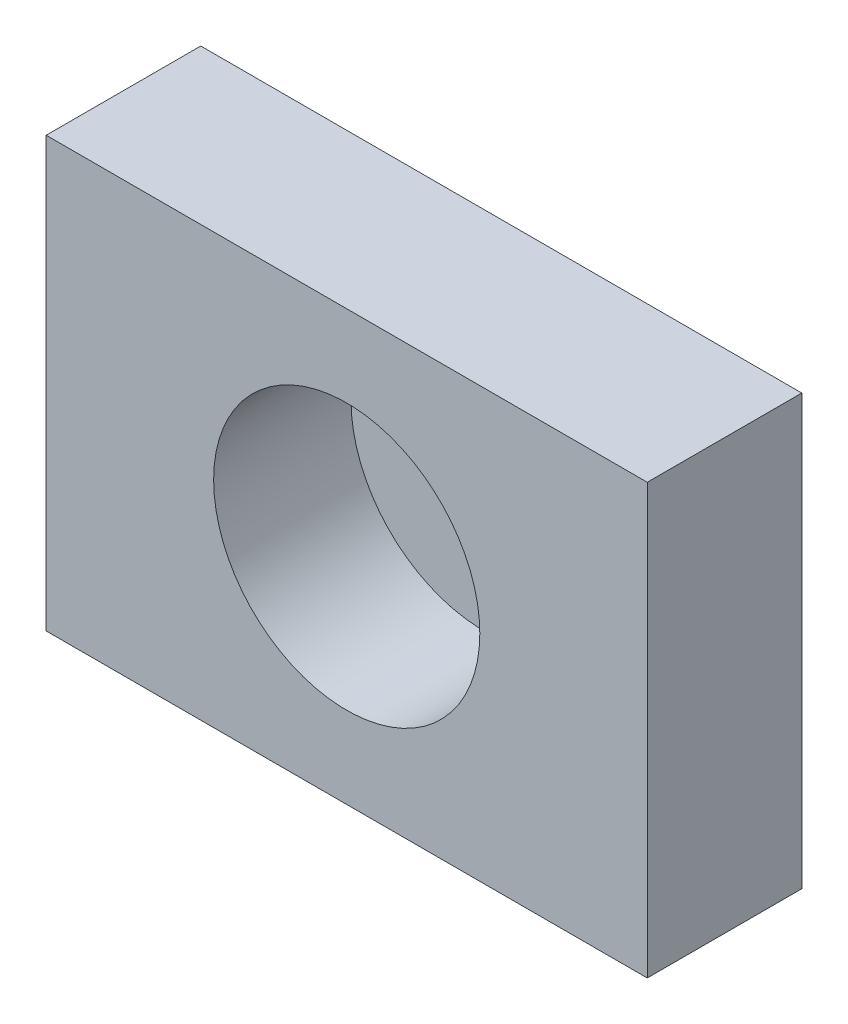
ISO-10303-21;
HEADER;
FILE_DESCRIPTION(('STEP AP214'),'2;1');
FILE_NAME('part.step','',(''),(''),'','','');
FILE_SCHEMA(('AUTOMOTIVE_DESIGN { 1 0 10303 214 1 1 1 1 }'));
ENDSEC;
DATA;
#1=APPLICATION_CONTEXT('core data for automotive mechanical design processes');
#2=APPLICATION_PROTOCOL_DEFINITION('international standard','automotive_design',2000,#1);
#3=PRODUCT_CONTEXT('',#1,'mechanical');
#4=PRODUCT('Part','Part','',(#3));
#5=PRODUCT_RELATED_PRODUCT_CATEGORY('part','',(#4));
#6=PRODUCT_DEFINITION_FORMATION('','',#4);
#7=PRODUCT_DEFINITION_CONTEXT('part definition',#1,'design');
#8=PRODUCT_DEFINITION('design','',#6,#7);
#9=PRODUCT_DEFINITION_SHAPE('','',#8);
#10=(LENGTH_UNIT() NAMED_UNIT(*) SI_UNIT(.MILLI.,.METRE.));
#11=(NAMED_UNIT(*) PLANE_ANGLE_UNIT() SI_UNIT($,.RADIAN.));
#12=(NAMED_UNIT(*) SI_UNIT($,.STERADIAN.) SOLID_ANGLE_UNIT());
#13=UNCERTAINTY_MEASURE_WITH_UNIT(LENGTH_MEASURE(1.E-05),#10,'distance_accuracy_value','');
#14=(GEOMETRIC_REPRESENTATION_CONTEXT(3) GLOBAL_UNCERTAINTY_ASSIGNED_CONTEXT((#13)) GLOBAL_UNIT_ASSIGNED_CONTEXT((#10,
#11,#12)) REPRESENTATION_CONTEXT('',''));
#15=CARTESIAN_POINT('',(0.,0.,0.));
#16=DIRECTION('',(0.,0.,1.));
#17=DIRECTION('',(1.,0.,0.));
#18=AXIS2_PLACEMENT_3D('',#15,#16,#17);
#19=CARTESIAN_POINT('',(0.,0.,18.));
#20=DIRECTION('',(0.,0.,1.));
#21=DIRECTION('',(1.,0.,0.));
#22=AXIS2_PLACEMENT_3D('',#19,#20,#21);
#23=PLANE('',#22);
#24=DIRECTION('',(0.,-1.,0.));
#25=VECTOR('',#24,1.);
#26=CARTESIAN_POINT('',(0.,50.,18.));
#27=LINE('',#26,#25);
#28=CARTESIAN_POINT('',(0.,50.,18.));
#29=VERTEX_POINT('',#28);
#30=CARTESIAN_POINT('',(0.,0.,18.));
#31=VERTEX_POINT('',#30);
#32=EDGE_CURVE('E94',#29,#31,#27,.T.);
#33=ORIENTED_EDGE('',*,*,#32,.T.);
#34=DIRECTION('',(1.,0.,0.));
#35=VECTOR('',#34,1.);
#36=CARTESIAN_POINT('',(0.,0.,18.));
#37=LINE('',#36,#35);
#38=CARTESIAN_POINT('',(70.,0.,18.));
#39=VERTEX_POINT('',#38);
#40=EDGE_CURVE('E89',#31,#39,#37,.T.);
#41=ORIENTED_EDGE('',*,*,#40,.T.);
#42=DIRECTION('',(0.,1.,0.));
#43=VECTOR('',#42,1.);
#44=CARTESIAN_POINT('',(70.,0.,18.));
#45=LINE('',#44,#43);
#46=CARTESIAN_POINT('',(70.,50.,18.));
#47=VERTEX_POINT('',#46);
#48=EDGE_CURVE('E92',#39,#47,#45,.T.);
#49=ORIENTED_EDGE('',*,*,#48,.T.);
#50=DIRECTION('',(-1.,0.,0.));
#51=VECTOR('',#50,1.);
#52=CARTESIAN_POINT('',(70.,50.,18.));
#53=LINE('',#52,#51);
#54=EDGE_CURVE('E58',#47,#29,#53,.T.);
#55=ORIENTED_EDGE('',*,*,#54,.T.);
#56=EDGE_LOOP('',(#33,#41,#49,#55));
#57=FACE_BOUND('',#56,.T.);
#58=CARTESIAN_POINT('',(35.,25.,18.));
#59=DIRECTION('',(0.,0.,1.));
#60=DIRECTION('',(1.,0.,0.));
#61=AXIS2_PLACEMENT_3D('',#58,#59,#60);
#62=CIRCLE('',#61,15.5);
#63=CARTESIAN_POINT('',(50.5,25.,18.));
#64=VERTEX_POINT('',#63);
#65=EDGE_CURVE('E111',#64,#64,#62,.T.);
#66=ORIENTED_EDGE('',*,*,#65,.F.);
#67=EDGE_LOOP('',(#66));
#68=FACE_BOUND('',#67,.T.);
#69=ADVANCED_FACE('F41',(#57,#68),#23,.T.);
#70=CARTESIAN_POINT('',(0.,0.,0.));
#71=DIRECTION('',(0.,0.,1.));
#72=DIRECTION('',(1.,0.,0.));
#73=AXIS2_PLACEMENT_3D('',#70,#71,#72);
#74=PLANE('',#73);
#75=DIRECTION('',(0.,-1.,0.));
#76=VECTOR('',#75,1.);
#77=CARTESIAN_POINT('',(0.,50.,0.));
#78=LINE('',#77,#76);
#79=CARTESIAN_POINT('',(0.,50.,0.));
#80=VERTEX_POINT('',#79);
#81=CARTESIAN_POINT('',(0.,0.,0.));
#82=VERTEX_POINT('',#81);
#83=EDGE_CURVE('E108',#80,#82,#78,.T.);
#84=ORIENTED_EDGE('',*,*,#83,.F.);
#85=DIRECTION('',(-1.,0.,0.));
#86=VECTOR('',#85,1.);
#87=CARTESIAN_POINT('',(70.,50.,0.));
#88=LINE('',#87,#86);
#89=CARTESIAN_POINT('',(70.,50.,0.));
#90=VERTEX_POINT('',#89);
#91=EDGE_CURVE('E81',#90,#80,#88,.T.);
#92=ORIENTED_EDGE('',*,*,#91,.F.);
#93=DIRECTION('',(0.,1.,0.));
#94=VECTOR('',#93,1.);
#95=CARTESIAN_POINT('',(70.,0.,0.));
#96=LINE('',#95,#94);
#97=CARTESIAN_POINT('',(70.,0.,0.));
#98=VERTEX_POINT('',#97);
#99=EDGE_CURVE('E75',#98,#90,#96,.T.);
#100=ORIENTED_EDGE('',*,*,#99,.F.);
#101=DIRECTION('',(1.,0.,0.));
#102=VECTOR('',#101,1.);
#103=CARTESIAN_POINT('',(0.,0.,0.));
#104=LINE('',#103,#102);
#105=EDGE_CURVE('E99',#82,#98,#104,.T.);
#106=ORIENTED_EDGE('',*,*,#105,.F.);
#107=EDGE_LOOP('',(#84,#92,#100,#106));
#108=FACE_BOUND('',#107,.T.);
#109=ADVANCED_FACE('F119',(#108),#74,.F.);
#110=CARTESIAN_POINT('',(0.,50.,18.));
#111=DIRECTION('',(1.,0.,0.));
#112=DIRECTION('',(0.,0.,-1.));
#113=AXIS2_PLACEMENT_3D('',#110,#111,#112);
#114=PLANE('',#113);
#115=ORIENTED_EDGE('',*,*,#83,.T.);
#116=DIRECTION('',(0.,0.,-1.));
#117=VECTOR('',#116,1.);
#118=CARTESIAN_POINT('',(0.,0.,18.));
#119=LINE('',#118,#117);
#120=EDGE_CURVE('E50',#31,#82,#119,.T.);
#121=ORIENTED_EDGE('',*,*,#120,.F.);
#122=ORIENTED_EDGE('',*,*,#32,.F.);
#123=DIRECTION('',(0.,0.,-1.));
#124=VECTOR('',#123,1.);
#125=CARTESIAN_POINT('',(0.,50.,18.));
#126=LINE('',#125,#124);
#127=EDGE_CURVE('E104',#29,#80,#126,.T.);
#128=ORIENTED_EDGE('',*,*,#127,.T.);
#129=EDGE_LOOP('',(#115,#121,#122,#128));
#130=FACE_BOUND('',#129,.T.);
#131=ADVANCED_FACE('F43',(#130),#114,.F.);
#132=CARTESIAN_POINT('',(0.,0.,18.));
#133=DIRECTION('',(0.,1.,0.));
#134=DIRECTION('',(0.,0.,1.));
#135=AXIS2_PLACEMENT_3D('',#132,#133,#134);
#136=PLANE('',#135);
#137=ORIENTED_EDGE('',*,*,#105,.T.);
#138=DIRECTION('',(0.,0.,-1.));
#139=VECTOR('',#138,1.);
#140=CARTESIAN_POINT('',(70.,0.,18.));
#141=LINE('',#140,#139);
#142=EDGE_CURVE('E97',#39,#98,#141,.T.);
#143=ORIENTED_EDGE('',*,*,#142,.F.);
#144=ORIENTED_EDGE('',*,*,#40,.F.);
#145=ORIENTED_EDGE('',*,*,#120,.T.);
#146=EDGE_LOOP('',(#137,#143,#144,#145));
#147=FACE_BOUND('',#146,.T.);
#148=ADVANCED_FACE('F98',(#147),#136,.F.);
#149=CARTESIAN_POINT('',(70.,0.,18.));
#150=DIRECTION('',(-1.,0.,0.));
#151=DIRECTION('',(0.,0.,1.));
#152=AXIS2_PLACEMENT_3D('',#149,#150,#151);
#153=PLANE('',#152);
#154=ORIENTED_EDGE('',*,*,#99,.T.);
#155=DIRECTION('',(0.,0.,-1.));
#156=VECTOR('',#155,1.);
#157=CARTESIAN_POINT('',(70.,50.,18.));
#158=LINE('',#157,#156);
#159=EDGE_CURVE('E100',#47,#90,#158,.T.);
#160=ORIENTED_EDGE('',*,*,#159,.F.);
#161=ORIENTED_EDGE('',*,*,#48,.F.);
#162=ORIENTED_EDGE('',*,*,#142,.T.);
#163=EDGE_LOOP('',(#154,#160,#161,#162));
#164=FACE_BOUND('',#163,.T.);
#165=ADVANCED_FACE('F102',(#164),#153,.F.);
#166=CARTESIAN_POINT('',(70.,50.,18.));
#167=DIRECTION('',(0.,-1.,0.));
#168=DIRECTION('',(0.,0.,-1.));
#169=AXIS2_PLACEMENT_3D('',#166,#167,#168);
#170=PLANE('',#169);
#171=ORIENTED_EDGE('',*,*,#91,.T.);
#172=ORIENTED_EDGE('',*,*,#127,.F.);
#173=ORIENTED_EDGE('',*,*,#54,.F.);
#174=ORIENTED_EDGE('',*,*,#159,.T.);
#175=EDGE_LOOP('',(#171,#172,#173,#174));
#176=FACE_BOUND('',#175,.T.);
#177=ADVANCED_FACE('F131',(#176),#170,.F.);
#178=CARTESIAN_POINT('',(35.,25.,18.));
#179=DIRECTION('',(0.,0.,-1.));
#180=DIRECTION('',(-1.,0.,0.));
#181=AXIS2_PLACEMENT_3D('',#178,#179,#180);
#182=CYLINDRICAL_SURFACE('',#181,15.5);
#183=CARTESIAN_POINT('',(35.,25.,2.));
#184=DIRECTION('',(0.,0.,1.));
#185=DIRECTION('',(1.,0.,0.));
#186=AXIS2_PLACEMENT_3D('',#183,#184,#185);
#187=CIRCLE('',#186,15.5);
#188=CARTESIAN_POINT('',(50.5,25.,2.));
#189=VERTEX_POINT('',#188);
#190=EDGE_CURVE('E11',#189,#189,#187,.T.);
#191=ORIENTED_EDGE('',*,*,#190,.F.);
#192=EDGE_LOOP('',(#191));
#193=FACE_BOUND('',#192,.T.);
#194=ORIENTED_EDGE('',*,*,#65,.T.);
#195=EDGE_LOOP('',(#194));
#196=FACE_BOUND('',#195,.T.);
#197=ADVANCED_FACE('F133',(#193,#196),#182,.F.);
#198=CARTESIAN_POINT('',(35.,25.,2.));
#199=DIRECTION('',(0.,0.,1.));
#200=DIRECTION('',(1.,0.,0.));
#201=AXIS2_PLACEMENT_3D('',#198,#199,#200);
#202=PLANE('',#201);
#203=ORIENTED_EDGE('',*,*,#190,.T.);
#204=EDGE_LOOP('',(#203));
#205=FACE_BOUND('',#204,.T.);
#206=ADVANCED_FACE('F158',(#205),#202,.T.);
#207=CLOSED_SHELL('',(#69,#109,#131,#148,#165,#177,#197,#206));
#208=MANIFOLD_SOLID_BREP('B2',#207);
#209=ADVANCED_BREP_SHAPE_REPRESENTATION('',(#18,#208),#14);
#210=SHAPE_DEFINITION_REPRESENTATION(#9,#209);
ENDSEC;
END-ISO-10303-21;
